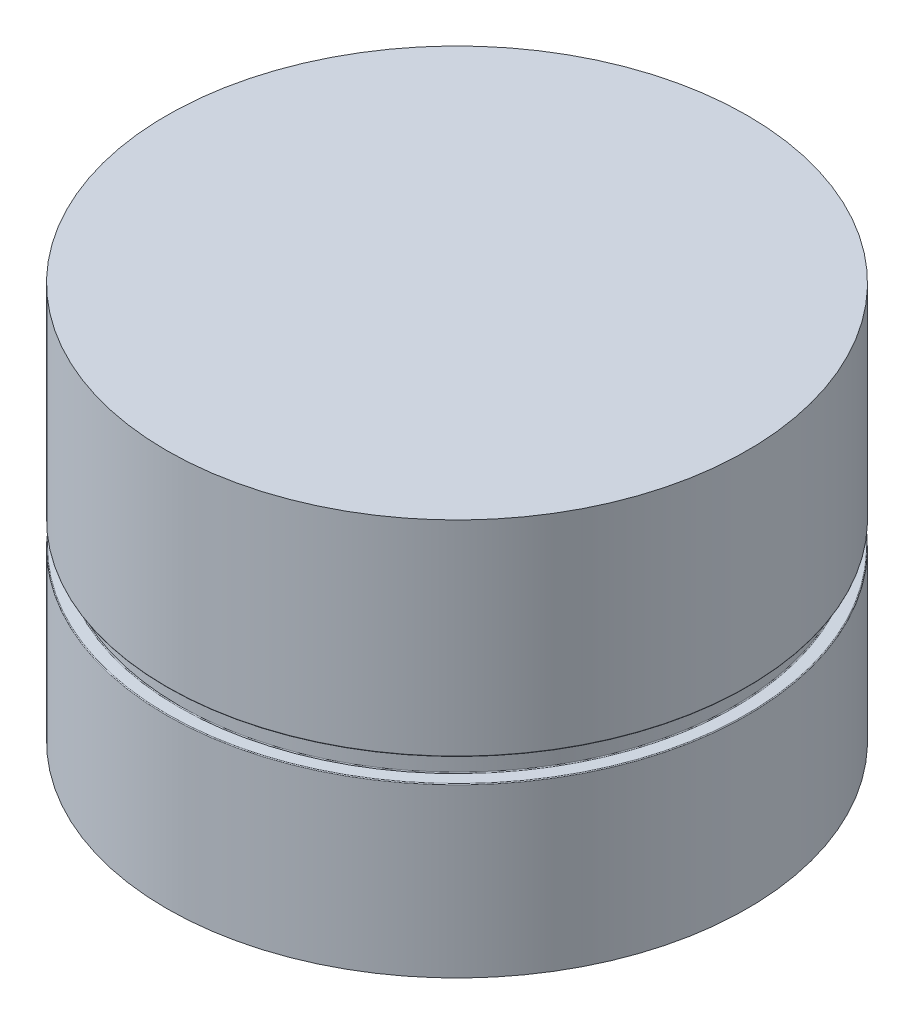
ISO-10303-21;
HEADER;
FILE_DESCRIPTION(('STEP AP214'),'2;1');
FILE_NAME('part.step','',(''),(''),'','','');
FILE_SCHEMA(('AUTOMOTIVE_DESIGN { 1 0 10303 214 1 1 1 1 }'));
ENDSEC;
DATA;
#1=APPLICATION_CONTEXT('core data for automotive mechanical design processes');
#2=APPLICATION_PROTOCOL_DEFINITION('international standard','automotive_design',2000,#1);
#3=PRODUCT_CONTEXT('',#1,'mechanical');
#4=PRODUCT('Part','Part','',(#3));
#5=PRODUCT_RELATED_PRODUCT_CATEGORY('part','',(#4));
#6=PRODUCT_DEFINITION_FORMATION('','',#4);
#7=PRODUCT_DEFINITION_CONTEXT('part definition',#1,'design');
#8=PRODUCT_DEFINITION('design','',#6,#7);
#9=PRODUCT_DEFINITION_SHAPE('','',#8);
#10=(LENGTH_UNIT() NAMED_UNIT(*) SI_UNIT(.MILLI.,.METRE.));
#11=(NAMED_UNIT(*) PLANE_ANGLE_UNIT() SI_UNIT($,.RADIAN.));
#12=(NAMED_UNIT(*) SI_UNIT($,.STERADIAN.) SOLID_ANGLE_UNIT());
#13=UNCERTAINTY_MEASURE_WITH_UNIT(LENGTH_MEASURE(1.E-05),#10,'distance_accuracy_value','');
#14=(GEOMETRIC_REPRESENTATION_CONTEXT(3) GLOBAL_UNCERTAINTY_ASSIGNED_CONTEXT((#13)) GLOBAL_UNIT_ASSIGNED_CONTEXT((#10,
#11,#12)) REPRESENTATION_CONTEXT('',''));
#15=CARTESIAN_POINT('',(0.,0.,0.));
#16=DIRECTION('',(0.,0.,1.));
#17=DIRECTION('',(1.,0.,0.));
#18=AXIS2_PLACEMENT_3D('',#15,#16,#17);
#19=CARTESIAN_POINT('',(0.,-33.4044212771882,0.));
#20=DIRECTION('',(0.,-1.,0.));
#21=DIRECTION('',(0.,0.,-1.));
#22=AXIS2_PLACEMENT_3D('',#19,#20,#21);
#23=PLANE('',#22);
#24=CARTESIAN_POINT('',(0.,-33.4044212771882,0.));
#25=DIRECTION('',(0.,1.,0.));
#26=DIRECTION('',(0.,0.,1.));
#27=AXIS2_PLACEMENT_3D('',#24,#25,#26);
#28=CIRCLE('',#27,46.4693);
#29=CARTESIAN_POINT('',(0.,-33.4044212771882,46.4693));
#30=VERTEX_POINT('',#29);
#31=EDGE_CURVE('E70',#30,#30,#28,.T.);
#32=ORIENTED_EDGE('',*,*,#31,.F.);
#33=EDGE_LOOP('',(#32));
#34=FACE_BOUND('',#33,.T.);
#35=ADVANCED_FACE('F40',(#34),#23,.T.);
#36=CARTESIAN_POINT('',(0.,32.1894098045235,0.));
#37=DIRECTION('',(0.,1.,0.));
#38=DIRECTION('',(0.,0.,1.));
#39=AXIS2_PLACEMENT_3D('',#36,#37,#38);
#40=CYLINDRICAL_SURFACE('',#39,46.4693);
#41=CARTESIAN_POINT('',(0.,-6.64123970800395,0.));
#42=DIRECTION('',(0.,-1.,0.));
#43=DIRECTION('',(0.,0.,-1.));
#44=AXIS2_PLACEMENT_3D('',#41,#42,#43);
#45=CIRCLE('',#44,46.4693);
#46=CARTESIAN_POINT('',(0.,-6.64123970800395,-46.4693));
#47=VERTEX_POINT('',#46);
#48=EDGE_CURVE('E64',#47,#47,#45,.T.);
#49=ORIENTED_EDGE('',*,*,#48,.T.);
#50=EDGE_LOOP('',(#49));
#51=FACE_BOUND('',#50,.T.);
#52=ORIENTED_EDGE('',*,*,#31,.T.);
#53=EDGE_LOOP('',(#52));
#54=FACE_BOUND('',#53,.T.);
#55=ADVANCED_FACE('F91',(#51,#54),#40,.T.);
#56=CARTESIAN_POINT('',(0.,-6.41422860052803,0.));
#57=DIRECTION('',(0.,-1.,0.));
#58=DIRECTION('',(0.,0.,-1.));
#59=AXIS2_PLACEMENT_3D('',#56,#57,#58);
#60=CONICAL_SURFACE('',#59,44.4373,1.51843644923507);
#61=CARTESIAN_POINT('',(0.,-6.42053605146908,0.));
#62=DIRECTION('',(0.,-1.,0.));
#63=DIRECTION('',(0.,0.,-1.));
#64=AXIS2_PLACEMENT_3D('',#61,#62,#63);
#65=CIRCLE('',#64,44.5576533335571);
#66=CARTESIAN_POINT('',(0.,-6.42053605146908,-44.5576533335571));
#67=VERTEX_POINT('',#66);
#68=EDGE_CURVE('E10',#67,#67,#65,.T.);
#69=ORIENTED_EDGE('',*,*,#68,.T.);
#70=EDGE_LOOP('',(#69));
#71=FACE_BOUND('',#70,.T.);
#72=CARTESIAN_POINT('',(0.,-6.51441375709013,0.));
#73=DIRECTION('',(0.,1.,0.));
#74=DIRECTION('',(0.,0.,1.));
#75=AXIS2_PLACEMENT_3D('',#72,#73,#74);
#76=CIRCLE('',#75,46.3489466664429);
#77=CARTESIAN_POINT('',(0.,-6.51441375709013,46.3489466664429));
#78=VERTEX_POINT('',#77);
#79=EDGE_CURVE('E68',#78,#78,#76,.T.);
#80=ORIENTED_EDGE('',*,*,#79,.T.);
#81=EDGE_LOOP('',(#80));
#82=FACE_BOUND('',#81,.T.);
#83=ADVANCED_FACE('F99',(#71,#82),#60,.T.);
#84=CARTESIAN_POINT('',(0.,32.1894098045235,0.));
#85=DIRECTION('',(0.,1.,0.));
#86=DIRECTION('',(0.,0.,1.));
#87=AXIS2_PLACEMENT_3D('',#84,#85,#86);
#88=CYLINDRICAL_SURFACE('',#87,44.4373);
#89=CARTESIAN_POINT('',(0.,-2.97874710050082,0.));
#90=DIRECTION('',(0.,1.,0.));
#91=DIRECTION('',(0.,0.,1.));
#92=AXIS2_PLACEMENT_3D('',#89,#90,#91);
#93=CIRCLE('',#92,44.4373);
#94=CARTESIAN_POINT('',(0.,-2.97874710050082,44.4373));
#95=VERTEX_POINT('',#94);
#96=EDGE_CURVE('E42',#95,#95,#93,.F.);
#97=ORIENTED_EDGE('',*,*,#96,.T.);
#98=EDGE_LOOP('',(#97));
#99=FACE_BOUND('',#98,.T.);
#100=CARTESIAN_POINT('',(0.,-6.29371010055524,0.));
#101=DIRECTION('',(0.,1.,0.));
#102=DIRECTION('',(0.,0.,1.));
#103=AXIS2_PLACEMENT_3D('',#100,#101,#102);
#104=CIRCLE('',#103,44.4373);
#105=CARTESIAN_POINT('',(0.,-6.29371010055524,44.4373));
#106=VERTEX_POINT('',#105);
#107=EDGE_CURVE('E48',#106,#106,#104,.T.);
#108=ORIENTED_EDGE('',*,*,#107,.T.);
#109=EDGE_LOOP('',(#108));
#110=FACE_BOUND('',#109,.T.);
#111=ADVANCED_FACE('F93',(#99,#110),#88,.T.);
#112=CARTESIAN_POINT('',(0.,-2.7517359930249,0.));
#113=DIRECTION('',(0.,1.,0.));
#114=DIRECTION('',(0.,0.,1.));
#115=AXIS2_PLACEMENT_3D('',#112,#113,#114);
#116=CONICAL_SURFACE('',#115,46.4693,1.51843644923507);
#117=CARTESIAN_POINT('',(0.,-2.8519211495871,0.));
#118=DIRECTION('',(0.,1.,0.));
#119=DIRECTION('',(0.,0.,1.));
#120=AXIS2_PLACEMENT_3D('',#117,#118,#119);
#121=CIRCLE('',#120,44.5576533335571);
#122=CARTESIAN_POINT('',(0.,-2.8519211495871,44.5576533335571));
#123=VERTEX_POINT('',#122);
#124=EDGE_CURVE('E55',#123,#123,#121,.T.);
#125=ORIENTED_EDGE('',*,*,#124,.T.);
#126=EDGE_LOOP('',(#125));
#127=FACE_BOUND('',#126,.T.);
#128=CARTESIAN_POINT('',(0.,-2.75804344396594,0.));
#129=DIRECTION('',(0.,-1.,0.));
#130=DIRECTION('',(0.,0.,-1.));
#131=AXIS2_PLACEMENT_3D('',#128,#129,#130);
#132=CIRCLE('',#131,46.3489466664428);
#133=CARTESIAN_POINT('',(0.,-2.75804344396594,-46.3489466664428));
#134=VERTEX_POINT('',#133);
#135=EDGE_CURVE('E60',#134,#134,#132,.T.);
#136=ORIENTED_EDGE('',*,*,#135,.T.);
#137=EDGE_LOOP('',(#136));
#138=FACE_BOUND('',#137,.T.);
#139=ADVANCED_FACE('F78',(#127,#138),#116,.T.);
#140=CARTESIAN_POINT('',(0.,32.1894098045235,0.));
#141=DIRECTION('',(0.,1.,0.));
#142=DIRECTION('',(0.,0.,1.));
#143=AXIS2_PLACEMENT_3D('',#140,#141,#142);
#144=CYLINDRICAL_SURFACE('',#143,46.4693);
#145=CARTESIAN_POINT('',(0.,-2.6312174930521,0.));
#146=DIRECTION('',(0.,-1.,0.));
#147=DIRECTION('',(0.,0.,-1.));
#148=AXIS2_PLACEMENT_3D('',#145,#146,#147);
#149=CIRCLE('',#148,46.4693);
#150=CARTESIAN_POINT('',(0.,-2.6312174930521,-46.4693));
#151=VERTEX_POINT('',#150);
#152=EDGE_CURVE('E58',#151,#151,#149,.F.);
#153=ORIENTED_EDGE('',*,*,#152,.T.);
#154=EDGE_LOOP('',(#153));
#155=FACE_BOUND('',#154,.T.);
#156=CARTESIAN_POINT('',(0.,30.0955787228118,0.));
#157=DIRECTION('',(0.,1.,0.));
#158=DIRECTION('',(0.,0.,1.));
#159=AXIS2_PLACEMENT_3D('',#156,#157,#158);
#160=CIRCLE('',#159,46.4693);
#161=CARTESIAN_POINT('',(0.,30.0955787228118,46.4693));
#162=VERTEX_POINT('',#161);
#163=EDGE_CURVE('E74',#162,#162,#160,.T.);
#164=ORIENTED_EDGE('',*,*,#163,.F.);
#165=EDGE_LOOP('',(#164));
#166=FACE_BOUND('',#165,.T.);
#167=ADVANCED_FACE('F76',(#155,#166),#144,.T.);
#168=CARTESIAN_POINT('',(-46.4693,30.0955787228118,0.));
#169=DIRECTION('',(0.,1.,0.));
#170=DIRECTION('',(0.,0.,1.));
#171=AXIS2_PLACEMENT_3D('',#168,#169,#170);
#172=PLANE('',#171);
#173=ORIENTED_EDGE('',*,*,#163,.T.);
#174=EDGE_LOOP('',(#173));
#175=FACE_BOUND('',#174,.T.);
#176=ADVANCED_FACE('F77',(#175),#172,.T.);
#177=CARTESIAN_POINT('',(0.,-6.64123970800396,0.));
#178=DIRECTION('',(0.,-1.,0.));
#179=DIRECTION('',(0.,0.,-1.));
#180=AXIS2_PLACEMENT_3D('',#177,#178,#179);
#181=TOROIDAL_SURFACE('',#180,46.3423,0.127);
#182=ORIENTED_EDGE('',*,*,#48,.F.);
#183=EDGE_LOOP('',(#182));
#184=FACE_BOUND('',#183,.T.);
#185=ORIENTED_EDGE('',*,*,#79,.F.);
#186=EDGE_LOOP('',(#185));
#187=FACE_BOUND('',#186,.T.);
#188=ADVANCED_FACE('F87',(#184,#187),#181,.T.);
#189=CARTESIAN_POINT('',(0.,-2.6312174930521,0.));
#190=DIRECTION('',(0.,-1.,0.));
#191=DIRECTION('',(0.,0.,-1.));
#192=AXIS2_PLACEMENT_3D('',#189,#190,#191);
#193=TOROIDAL_SURFACE('',#192,46.3423,0.127);
#194=ORIENTED_EDGE('',*,*,#135,.F.);
#195=EDGE_LOOP('',(#194));
#196=FACE_BOUND('',#195,.T.);
#197=ORIENTED_EDGE('',*,*,#152,.F.);
#198=EDGE_LOOP('',(#197));
#199=FACE_BOUND('',#198,.T.);
#200=ADVANCED_FACE('F110',(#196,#199),#193,.T.);
#201=CARTESIAN_POINT('',(0.,-2.97874710050082,0.));
#202=DIRECTION('',(0.,1.,0.));
#203=DIRECTION('',(0.,0.,1.));
#204=AXIS2_PLACEMENT_3D('',#201,#202,#203);
#205=TOROIDAL_SURFACE('',#204,44.5643,0.127);
#206=ORIENTED_EDGE('',*,*,#96,.F.);
#207=EDGE_LOOP('',(#206));
#208=FACE_BOUND('',#207,.T.);
#209=ORIENTED_EDGE('',*,*,#124,.F.);
#210=EDGE_LOOP('',(#209));
#211=FACE_BOUND('',#210,.T.);
#212=ADVANCED_FACE('F109',(#208,#211),#205,.F.);
#213=CARTESIAN_POINT('',(0.,-6.29371010055524,0.));
#214=DIRECTION('',(0.,1.,0.));
#215=DIRECTION('',(0.,0.,1.));
#216=AXIS2_PLACEMENT_3D('',#213,#214,#215);
#217=TOROIDAL_SURFACE('',#216,44.5643,0.127);
#218=ORIENTED_EDGE('',*,*,#68,.F.);
#219=EDGE_LOOP('',(#218));
#220=FACE_BOUND('',#219,.T.);
#221=ORIENTED_EDGE('',*,*,#107,.F.);
#222=EDGE_LOOP('',(#221));
#223=FACE_BOUND('',#222,.T.);
#224=ADVANCED_FACE('F39',(#220,#223),#217,.F.);
#225=CLOSED_SHELL('',(#35,#55,#83,#111,#139,#167,#176,#188,#200,#212,#224));
#226=MANIFOLD_SOLID_BREP('B2',#225);
#227=ADVANCED_BREP_SHAPE_REPRESENTATION('',(#18,#226),#14);
#228=SHAPE_DEFINITION_REPRESENTATION(#9,#227);
ENDSEC;
END-ISO-10303-21;
